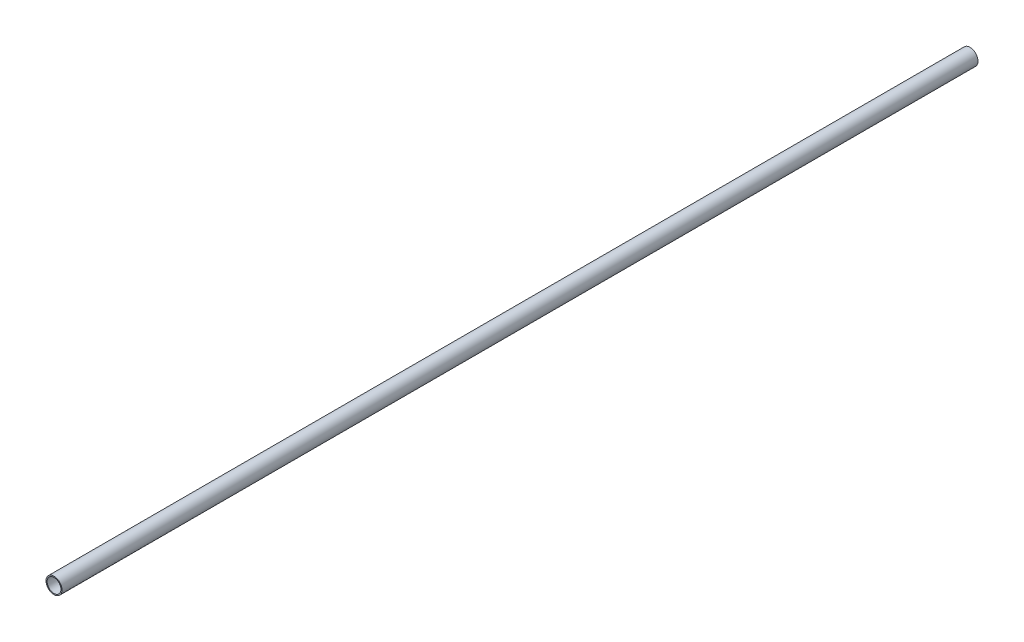
ISO-10303-21;
HEADER;
FILE_DESCRIPTION(('STEP AP214'),'2;1');
FILE_NAME('part.step','',(''),(''),'','','');
FILE_SCHEMA(('AUTOMOTIVE_DESIGN { 1 0 10303 214 1 1 1 1 }'));
ENDSEC;
DATA;
#1=APPLICATION_CONTEXT('core data for automotive mechanical design processes');
#2=APPLICATION_PROTOCOL_DEFINITION('international standard','automotive_design',2000,#1);
#3=PRODUCT_CONTEXT('',#1,'mechanical');
#4=PRODUCT('Part','Part','',(#3));
#5=PRODUCT_RELATED_PRODUCT_CATEGORY('part','',(#4));
#6=PRODUCT_DEFINITION_FORMATION('','',#4);
#7=PRODUCT_DEFINITION_CONTEXT('part definition',#1,'design');
#8=PRODUCT_DEFINITION('design','',#6,#7);
#9=PRODUCT_DEFINITION_SHAPE('','',#8);
#10=(LENGTH_UNIT() NAMED_UNIT(*) SI_UNIT(.MILLI.,.METRE.));
#11=(NAMED_UNIT(*) PLANE_ANGLE_UNIT() SI_UNIT($,.RADIAN.));
#12=(NAMED_UNIT(*) SI_UNIT($,.STERADIAN.) SOLID_ANGLE_UNIT());
#13=UNCERTAINTY_MEASURE_WITH_UNIT(LENGTH_MEASURE(1.E-05),#10,'distance_accuracy_value','');
#14=(GEOMETRIC_REPRESENTATION_CONTEXT(3) GLOBAL_UNCERTAINTY_ASSIGNED_CONTEXT((#13)) GLOBAL_UNIT_ASSIGNED_CONTEXT((#10,
#11,#12)) REPRESENTATION_CONTEXT('',''));
#15=CARTESIAN_POINT('',(0.,0.,0.));
#16=DIRECTION('',(0.,0.,1.));
#17=DIRECTION('',(1.,0.,0.));
#18=AXIS2_PLACEMENT_3D('',#15,#16,#17);
#19=CARTESIAN_POINT('',(0.,0.,420.));
#20=DIRECTION('',(0.,0.,1.));
#21=DIRECTION('',(1.,0.,0.));
#22=AXIS2_PLACEMENT_3D('',#19,#20,#21);
#23=PLANE('',#22);
#24=CARTESIAN_POINT('',(0.,0.,420.));
#25=DIRECTION('',(0.,0.,1.));
#26=DIRECTION('',(1.,0.,0.));
#27=AXIS2_PLACEMENT_3D('',#24,#25,#26);
#28=CIRCLE('',#27,3.675);
#29=CARTESIAN_POINT('',(3.675,0.,420.));
#30=VERTEX_POINT('',#29);
#31=EDGE_CURVE('E10',#30,#30,#28,.T.);
#32=ORIENTED_EDGE('',*,*,#31,.T.);
#33=EDGE_LOOP('',(#32));
#34=FACE_BOUND('',#33,.T.);
#35=CARTESIAN_POINT('',(0.,0.,420.));
#36=DIRECTION('',(0.,0.,1.));
#37=DIRECTION('',(1.,0.,0.));
#38=AXIS2_PLACEMENT_3D('',#35,#36,#37);
#39=CIRCLE('',#38,3.175);
#40=CARTESIAN_POINT('',(3.175,0.,420.));
#41=VERTEX_POINT('',#40);
#42=EDGE_CURVE('E44',#41,#41,#39,.T.);
#43=ORIENTED_EDGE('',*,*,#42,.F.);
#44=EDGE_LOOP('',(#43));
#45=FACE_BOUND('',#44,.T.);
#46=ADVANCED_FACE('F33',(#34,#45),#23,.T.);
#47=CARTESIAN_POINT('',(0.,0.,0.));
#48=DIRECTION('',(0.,0.,1.));
#49=DIRECTION('',(1.,0.,0.));
#50=AXIS2_PLACEMENT_3D('',#47,#48,#49);
#51=PLANE('',#50);
#52=CARTESIAN_POINT('',(0.,0.,0.));
#53=DIRECTION('',(0.,0.,1.));
#54=DIRECTION('',(1.,0.,0.));
#55=AXIS2_PLACEMENT_3D('',#52,#53,#54);
#56=CIRCLE('',#55,3.675);
#57=CARTESIAN_POINT('',(3.675,0.,0.));
#58=VERTEX_POINT('',#57);
#59=EDGE_CURVE('E37',#58,#58,#56,.T.);
#60=ORIENTED_EDGE('',*,*,#59,.F.);
#61=EDGE_LOOP('',(#60));
#62=FACE_BOUND('',#61,.T.);
#63=CARTESIAN_POINT('',(0.,0.,0.));
#64=DIRECTION('',(0.,0.,1.));
#65=DIRECTION('',(1.,0.,0.));
#66=AXIS2_PLACEMENT_3D('',#63,#64,#65);
#67=CIRCLE('',#66,3.175);
#68=CARTESIAN_POINT('',(3.175,0.,0.));
#69=VERTEX_POINT('',#68);
#70=EDGE_CURVE('E46',#69,#69,#67,.T.);
#71=ORIENTED_EDGE('',*,*,#70,.T.);
#72=EDGE_LOOP('',(#71));
#73=FACE_BOUND('',#72,.T.);
#74=ADVANCED_FACE('F56',(#62,#73),#51,.F.);
#75=CARTESIAN_POINT('',(0.,0.,420.));
#76=DIRECTION('',(0.,0.,-1.));
#77=DIRECTION('',(-1.,0.,0.));
#78=AXIS2_PLACEMENT_3D('',#75,#76,#77);
#79=CYLINDRICAL_SURFACE('',#78,3.675);
#80=ORIENTED_EDGE('',*,*,#31,.F.);
#81=EDGE_LOOP('',(#80));
#82=FACE_BOUND('',#81,.T.);
#83=ORIENTED_EDGE('',*,*,#59,.T.);
#84=EDGE_LOOP('',(#83));
#85=FACE_BOUND('',#84,.T.);
#86=ADVANCED_FACE('F35',(#82,#85),#79,.T.);
#87=CARTESIAN_POINT('',(0.,0.,420.));
#88=DIRECTION('',(0.,0.,-1.));
#89=DIRECTION('',(-1.,0.,0.));
#90=AXIS2_PLACEMENT_3D('',#87,#88,#89);
#91=CYLINDRICAL_SURFACE('',#90,3.175);
#92=ORIENTED_EDGE('',*,*,#42,.T.);
#93=EDGE_LOOP('',(#92));
#94=FACE_BOUND('',#93,.T.);
#95=ORIENTED_EDGE('',*,*,#70,.F.);
#96=EDGE_LOOP('',(#95));
#97=FACE_BOUND('',#96,.T.);
#98=ADVANCED_FACE('F52',(#94,#97),#91,.F.);
#99=CLOSED_SHELL('',(#46,#74,#86,#98));
#100=MANIFOLD_SOLID_BREP('B2',#99);
#101=ADVANCED_BREP_SHAPE_REPRESENTATION('',(#18,#100),#14);
#102=SHAPE_DEFINITION_REPRESENTATION(#9,#101);
ENDSEC;
END-ISO-10303-21;
